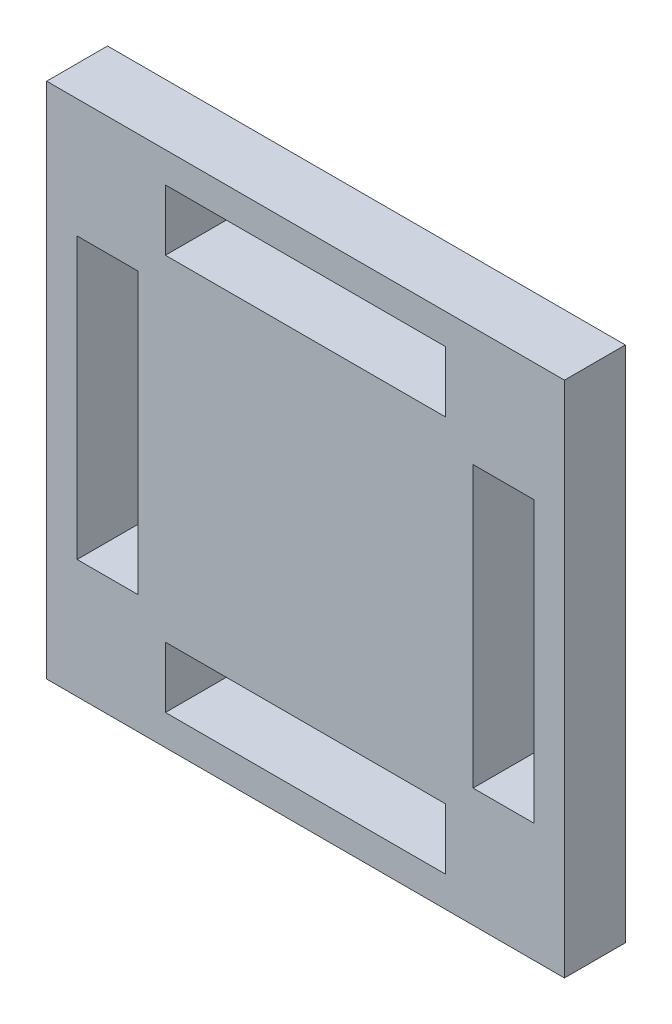
ISO-10303-21;
HEADER;
FILE_DESCRIPTION(('STEP AP214'),'2;1');
FILE_NAME('part.step','',(''),(''),'','','');
FILE_SCHEMA(('AUTOMOTIVE_DESIGN { 1 0 10303 214 1 1 1 1 }'));
ENDSEC;
DATA;
#1=APPLICATION_CONTEXT('core data for automotive mechanical design processes');
#2=APPLICATION_PROTOCOL_DEFINITION('international standard','automotive_design',2000,#1);
#3=PRODUCT_CONTEXT('',#1,'mechanical');
#4=PRODUCT('Part','Part','',(#3));
#5=PRODUCT_RELATED_PRODUCT_CATEGORY('part','',(#4));
#6=PRODUCT_DEFINITION_FORMATION('','',#4);
#7=PRODUCT_DEFINITION_CONTEXT('part definition',#1,'design');
#8=PRODUCT_DEFINITION('design','',#6,#7);
#9=PRODUCT_DEFINITION_SHAPE('','',#8);
#10=(LENGTH_UNIT() NAMED_UNIT(*) SI_UNIT(.MILLI.,.METRE.));
#11=(NAMED_UNIT(*) PLANE_ANGLE_UNIT() SI_UNIT($,.RADIAN.));
#12=(NAMED_UNIT(*) SI_UNIT($,.STERADIAN.) SOLID_ANGLE_UNIT());
#13=UNCERTAINTY_MEASURE_WITH_UNIT(LENGTH_MEASURE(1.E-05),#10,'distance_accuracy_value','');
#14=(GEOMETRIC_REPRESENTATION_CONTEXT(3) GLOBAL_UNCERTAINTY_ASSIGNED_CONTEXT((#13)) GLOBAL_UNIT_ASSIGNED_CONTEXT((#10,
#11,#12)) REPRESENTATION_CONTEXT('',''));
#15=CARTESIAN_POINT('',(0.,0.,0.));
#16=DIRECTION('',(0.,0.,1.));
#17=DIRECTION('',(1.,0.,0.));
#18=AXIS2_PLACEMENT_3D('',#15,#16,#17);
#19=CARTESIAN_POINT('',(0.,0.,0.));
#20=DIRECTION('',(0.,0.,-1.));
#21=DIRECTION('',(-1.,0.,0.));
#22=AXIS2_PLACEMENT_3D('',#19,#20,#21);
#23=PLANE('',#22);
#24=CARTESIAN_POINT('',(0.,0.,0.));
#25=DIRECTION('',(0.,0.,-1.));
#26=DIRECTION('',(-1.,0.,0.));
#27=AXIS2_PLACEMENT_3D('',#24,#25,#26);
#28=CIRCLE('',#27,17.5);
#29=CARTESIAN_POINT('',(-17.5,0.,0.));
#30=VERTEX_POINT('',#29);
#31=EDGE_CURVE('E38',#30,#30,#28,.T.);
#32=ORIENTED_EDGE('',*,*,#31,.F.);
#33=EDGE_LOOP('',(#32));
#34=FACE_BOUND('',#33,.T.);
#35=DIRECTION('',(1.,0.,0.));
#36=VECTOR('',#35,1.);
#37=CARTESIAN_POINT('',(-27.5,27.5,0.));
#38=LINE('',#37,#36);
#39=CARTESIAN_POINT('',(-27.5,27.5,0.));
#40=VERTEX_POINT('',#39);
#41=CARTESIAN_POINT('',(27.5,27.5,0.));
#42=VERTEX_POINT('',#41);
#43=EDGE_CURVE('E355',#40,#42,#38,.T.);
#44=ORIENTED_EDGE('',*,*,#43,.T.);
#45=DIRECTION('',(0.,-1.,0.));
#46=VECTOR('',#45,1.);
#47=CARTESIAN_POINT('',(27.5,-27.5,0.));
#48=LINE('',#47,#46);
#49=CARTESIAN_POINT('',(27.5,-27.5,0.));
#50=VERTEX_POINT('',#49);
#51=EDGE_CURVE('E254',#42,#50,#48,.T.);
#52=ORIENTED_EDGE('',*,*,#51,.T.);
#53=DIRECTION('',(-1.,0.,0.));
#54=VECTOR('',#53,1.);
#55=CARTESIAN_POINT('',(-27.5,-27.5,0.));
#56=LINE('',#55,#54);
#57=CARTESIAN_POINT('',(-27.5,-27.5,0.));
#58=VERTEX_POINT('',#57);
#59=EDGE_CURVE('E351',#50,#58,#56,.T.);
#60=ORIENTED_EDGE('',*,*,#59,.T.);
#61=DIRECTION('',(0.,1.,0.));
#62=VECTOR('',#61,1.);
#63=CARTESIAN_POINT('',(-27.5,-27.5,0.));
#64=LINE('',#63,#62);
#65=EDGE_CURVE('E57',#58,#40,#64,.T.);
#66=ORIENTED_EDGE('',*,*,#65,.T.);
#67=EDGE_LOOP('',(#44,#52,#60,#66));
#68=FACE_BOUND('',#67,.T.);
#69=ADVANCED_FACE('F35',(#34,#68),#23,.T.);
#70=CARTESIAN_POINT('',(0.,0.,1.));
#71=DIRECTION('',(0.,0.,-1.));
#72=DIRECTION('',(-1.,0.,0.));
#73=AXIS2_PLACEMENT_3D('',#70,#71,#72);
#74=CYLINDRICAL_SURFACE('',#73,17.5);
#75=CARTESIAN_POINT('',(0.,0.,1.));
#76=DIRECTION('',(0.,0.,-1.));
#77=DIRECTION('',(-1.,0.,0.));
#78=AXIS2_PLACEMENT_3D('',#75,#76,#77);
#79=CIRCLE('',#78,17.5);
#80=CARTESIAN_POINT('',(-17.5,0.,1.));
#81=VERTEX_POINT('',#80);
#82=EDGE_CURVE('E11',#81,#81,#79,.T.);
#83=ORIENTED_EDGE('',*,*,#82,.F.);
#84=EDGE_LOOP('',(#83));
#85=FACE_BOUND('',#84,.T.);
#86=ORIENTED_EDGE('',*,*,#31,.T.);
#87=EDGE_LOOP('',(#86));
#88=FACE_BOUND('',#87,.T.);
#89=ADVANCED_FACE('F442',(#85,#88),#74,.F.);
#90=CARTESIAN_POINT('',(0.,0.,1.));
#91=DIRECTION('',(0.,0.,-1.));
#92=DIRECTION('',(-1.,0.,0.));
#93=AXIS2_PLACEMENT_3D('',#90,#91,#92);
#94=PLANE('',#93);
#95=ORIENTED_EDGE('',*,*,#82,.T.);
#96=EDGE_LOOP('',(#95));
#97=FACE_BOUND('',#96,.T.);
#98=ADVANCED_FACE('F447',(#97),#94,.T.);
#99=CARTESIAN_POINT('',(0.,0.,5.));
#100=DIRECTION('',(0.,0.,-1.));
#101=DIRECTION('',(-1.,0.,0.));
#102=AXIS2_PLACEMENT_3D('',#99,#100,#101);
#103=PLANE('',#102);
#104=DIRECTION('',(-1.,0.,0.));
#105=VECTOR('',#104,1.);
#106=CARTESIAN_POINT('',(37.5,-37.5,5.));
#107=LINE('',#106,#105);
#108=CARTESIAN_POINT('',(23.,-37.5,5.));
#109=VERTEX_POINT('',#108);
#110=CARTESIAN_POINT('',(-23.,-37.5,5.));
#111=VERTEX_POINT('',#110);
#112=EDGE_CURVE('E221',#109,#111,#107,.T.);
#113=ORIENTED_EDGE('',*,*,#112,.F.);
#114=DIRECTION('',(0.,-1.,0.));
#115=VECTOR('',#114,1.);
#116=CARTESIAN_POINT('',(23.,-27.5,5.));
#117=LINE('',#116,#115);
#118=CARTESIAN_POINT('',(23.,-27.5,5.));
#119=VERTEX_POINT('',#118);
#120=EDGE_CURVE('E295',#119,#109,#117,.T.);
#121=ORIENTED_EDGE('',*,*,#120,.F.);
#122=DIRECTION('',(-1.,0.,0.));
#123=VECTOR('',#122,1.);
#124=CARTESIAN_POINT('',(-27.5,-27.5,5.));
#125=LINE('',#124,#123);
#126=CARTESIAN_POINT('',(27.5,-27.5,5.));
#127=VERTEX_POINT('',#126);
#128=EDGE_CURVE('E337',#127,#119,#125,.T.);
#129=ORIENTED_EDGE('',*,*,#128,.F.);
#130=DIRECTION('',(0.,-1.,0.));
#131=VECTOR('',#130,1.);
#132=CARTESIAN_POINT('',(27.5,-27.5,5.));
#133=LINE('',#132,#131);
#134=CARTESIAN_POINT('',(27.5,-23.,5.));
#135=VERTEX_POINT('',#134);
#136=EDGE_CURVE('E336',#135,#127,#133,.T.);
#137=ORIENTED_EDGE('',*,*,#136,.F.);
#138=DIRECTION('',(-1.,0.,0.));
#139=VECTOR('',#138,1.);
#140=CARTESIAN_POINT('',(37.5,-23.,5.));
#141=LINE('',#140,#139);
#142=CARTESIAN_POINT('',(37.5,-23.,5.));
#143=VERTEX_POINT('',#142);
#144=EDGE_CURVE('E246',#143,#135,#141,.T.);
#145=ORIENTED_EDGE('',*,*,#144,.F.);
#146=DIRECTION('',(0.,-1.,0.));
#147=VECTOR('',#146,1.);
#148=CARTESIAN_POINT('',(37.5,-37.5,5.));
#149=LINE('',#148,#147);
#150=CARTESIAN_POINT('',(37.5,23.,5.));
#151=VERTEX_POINT('',#150);
#152=EDGE_CURVE('E223',#151,#143,#149,.T.);
#153=ORIENTED_EDGE('',*,*,#152,.F.);
#154=DIRECTION('',(1.,0.,0.));
#155=VECTOR('',#154,1.);
#156=CARTESIAN_POINT('',(37.5,23.,5.));
#157=LINE('',#156,#155);
#158=CARTESIAN_POINT('',(27.5,23.,5.));
#159=VERTEX_POINT('',#158);
#160=EDGE_CURVE('E239',#159,#151,#157,.T.);
#161=ORIENTED_EDGE('',*,*,#160,.F.);
#162=CARTESIAN_POINT('',(27.5,27.5,5.));
#163=VERTEX_POINT('',#162);
#164=EDGE_CURVE('E332',#163,#159,#133,.T.);
#165=ORIENTED_EDGE('',*,*,#164,.F.);
#166=DIRECTION('',(1.,0.,0.));
#167=VECTOR('',#166,1.);
#168=CARTESIAN_POINT('',(-27.5,27.5,5.));
#169=LINE('',#168,#167);
#170=CARTESIAN_POINT('',(23.,27.5,5.));
#171=VERTEX_POINT('',#170);
#172=EDGE_CURVE('E344',#171,#163,#169,.T.);
#173=ORIENTED_EDGE('',*,*,#172,.F.);
#174=DIRECTION('',(0.,-1.,0.));
#175=VECTOR('',#174,1.);
#176=CARTESIAN_POINT('',(23.,27.5,5.));
#177=LINE('',#176,#175);
#178=CARTESIAN_POINT('',(23.,37.5,5.));
#179=VERTEX_POINT('',#178);
#180=EDGE_CURVE('E319',#179,#171,#177,.T.);
#181=ORIENTED_EDGE('',*,*,#180,.F.);
#182=DIRECTION('',(1.,0.,0.));
#183=VECTOR('',#182,1.);
#184=CARTESIAN_POINT('',(37.5,37.5,5.));
#185=LINE('',#184,#183);
#186=CARTESIAN_POINT('',(-23.,37.5,5.));
#187=VERTEX_POINT('',#186);
#188=EDGE_CURVE('E414',#187,#179,#185,.T.);
#189=ORIENTED_EDGE('',*,*,#188,.F.);
#190=DIRECTION('',(0.,1.,0.));
#191=VECTOR('',#190,1.);
#192=CARTESIAN_POINT('',(-23.,27.5,5.));
#193=LINE('',#192,#191);
#194=CARTESIAN_POINT('',(-23.,27.5,5.));
#195=VERTEX_POINT('',#194);
#196=EDGE_CURVE('E312',#195,#187,#193,.T.);
#197=ORIENTED_EDGE('',*,*,#196,.F.);
#198=CARTESIAN_POINT('',(-27.5,27.5,5.));
#199=VERTEX_POINT('',#198);
#200=EDGE_CURVE('E345',#199,#195,#169,.T.);
#201=ORIENTED_EDGE('',*,*,#200,.F.);
#202=DIRECTION('',(0.,1.,0.));
#203=VECTOR('',#202,1.);
#204=CARTESIAN_POINT('',(-27.5,-27.5,5.));
#205=LINE('',#204,#203);
#206=CARTESIAN_POINT('',(-27.5,23.,5.));
#207=VERTEX_POINT('',#206);
#208=EDGE_CURVE('E340',#207,#199,#205,.T.);
#209=ORIENTED_EDGE('',*,*,#208,.F.);
#210=DIRECTION('',(1.,0.,0.));
#211=VECTOR('',#210,1.);
#212=CARTESIAN_POINT('',(-27.5,23.,5.));
#213=LINE('',#212,#211);
#214=CARTESIAN_POINT('',(-37.5,23.,5.));
#215=VERTEX_POINT('',#214);
#216=EDGE_CURVE('E264',#215,#207,#213,.T.);
#217=ORIENTED_EDGE('',*,*,#216,.F.);
#218=DIRECTION('',(0.,1.,0.));
#219=VECTOR('',#218,1.);
#220=CARTESIAN_POINT('',(-37.5,-37.5,5.));
#221=LINE('',#220,#219);
#222=CARTESIAN_POINT('',(-37.5,-23.,5.));
#223=VERTEX_POINT('',#222);
#224=EDGE_CURVE('E412',#223,#215,#221,.T.);
#225=ORIENTED_EDGE('',*,*,#224,.F.);
#226=DIRECTION('',(-1.,0.,0.));
#227=VECTOR('',#226,1.);
#228=CARTESIAN_POINT('',(-27.5,-23.,5.));
#229=LINE('',#228,#227);
#230=CARTESIAN_POINT('',(-27.5,-23.,5.));
#231=VERTEX_POINT('',#230);
#232=EDGE_CURVE('E271',#231,#223,#229,.T.);
#233=ORIENTED_EDGE('',*,*,#232,.F.);
#234=CARTESIAN_POINT('',(-27.5,-27.5,5.));
#235=VERTEX_POINT('',#234);
#236=EDGE_CURVE('E341',#235,#231,#205,.T.);
#237=ORIENTED_EDGE('',*,*,#236,.F.);
#238=CARTESIAN_POINT('',(-23.,-27.5,5.));
#239=VERTEX_POINT('',#238);
#240=EDGE_CURVE('E335',#239,#235,#125,.T.);
#241=ORIENTED_EDGE('',*,*,#240,.F.);
#242=DIRECTION('',(0.,1.,0.));
#243=VECTOR('',#242,1.);
#244=CARTESIAN_POINT('',(-23.,-27.5,5.));
#245=LINE('',#244,#243);
#246=EDGE_CURVE('E288',#111,#239,#245,.T.);
#247=ORIENTED_EDGE('',*,*,#246,.F.);
#248=EDGE_LOOP('',(#113,#121,#129,#137,#145,#153,#161,#165,#173,#181,#189,#197,#201,#209,#217,
#225,#233,#237,#241,#247));
#249=FACE_BOUND('',#248,.T.);
#250=DIRECTION('',(0.,1.,0.));
#251=VECTOR('',#250,1.);
#252=CARTESIAN_POINT('',(-42.5,-42.5,5.));
#253=LINE('',#252,#251);
#254=CARTESIAN_POINT('',(-42.5,-42.5,5.));
#255=VERTEX_POINT('',#254);
#256=CARTESIAN_POINT('',(-42.5,42.5,5.));
#257=VERTEX_POINT('',#256);
#258=EDGE_CURVE('E202',#255,#257,#253,.T.);
#259=ORIENTED_EDGE('',*,*,#258,.T.);
#260=DIRECTION('',(1.,0.,0.));
#261=VECTOR('',#260,1.);
#262=CARTESIAN_POINT('',(42.5,42.5,5.));
#263=LINE('',#262,#261);
#264=CARTESIAN_POINT('',(42.5,42.5,5.));
#265=VERTEX_POINT('',#264);
#266=EDGE_CURVE('E211',#257,#265,#263,.T.);
#267=ORIENTED_EDGE('',*,*,#266,.T.);
#268=DIRECTION('',(0.,-1.,0.));
#269=VECTOR('',#268,1.);
#270=CARTESIAN_POINT('',(42.5,-42.5,5.));
#271=LINE('',#270,#269);
#272=CARTESIAN_POINT('',(42.5,-42.5,5.));
#273=VERTEX_POINT('',#272);
#274=EDGE_CURVE('E217',#265,#273,#271,.T.);
#275=ORIENTED_EDGE('',*,*,#274,.T.);
#276=DIRECTION('',(-1.,0.,0.));
#277=VECTOR('',#276,1.);
#278=CARTESIAN_POINT('',(42.5,-42.5,5.));
#279=LINE('',#278,#277);
#280=EDGE_CURVE('E208',#273,#255,#279,.T.);
#281=ORIENTED_EDGE('',*,*,#280,.T.);
#282=EDGE_LOOP('',(#259,#267,#275,#281));
#283=FACE_BOUND('',#282,.T.);
#284=ADVANCED_FACE('F219',(#249,#283),#103,.T.);
#285=CARTESIAN_POINT('',(27.5,-27.5,5.));
#286=DIRECTION('',(1.,0.,0.));
#287=DIRECTION('',(0.,0.,-1.));
#288=AXIS2_PLACEMENT_3D('',#285,#286,#287);
#289=PLANE('',#288);
#290=ORIENTED_EDGE('',*,*,#51,.F.);
#291=DIRECTION('',(0.,0.,-1.));
#292=VECTOR('',#291,1.);
#293=CARTESIAN_POINT('',(27.5,27.5,5.));
#294=LINE('',#293,#292);
#295=EDGE_CURVE('E358',#163,#42,#294,.T.);
#296=ORIENTED_EDGE('',*,*,#295,.F.);
#297=ORIENTED_EDGE('',*,*,#164,.T.);
#298=DIRECTION('',(0.,0.,-1.));
#299=VECTOR('',#298,1.);
#300=CARTESIAN_POINT('',(27.5,23.,15.));
#301=LINE('',#300,#299);
#302=CARTESIAN_POINT('',(27.5,23.,15.));
#303=VERTEX_POINT('',#302);
#304=EDGE_CURVE('E255',#303,#159,#301,.T.);
#305=ORIENTED_EDGE('',*,*,#304,.F.);
#306=DIRECTION('',(0.,1.,0.));
#307=VECTOR('',#306,1.);
#308=CARTESIAN_POINT('',(27.5,23.,15.));
#309=LINE('',#308,#307);
#310=CARTESIAN_POINT('',(27.5,-23.,15.));
#311=VERTEX_POINT('',#310);
#312=EDGE_CURVE('E238',#311,#303,#309,.T.);
#313=ORIENTED_EDGE('',*,*,#312,.F.);
#314=DIRECTION('',(0.,0.,-1.));
#315=VECTOR('',#314,1.);
#316=CARTESIAN_POINT('',(27.5,-23.,15.));
#317=LINE('',#316,#315);
#318=EDGE_CURVE('E257',#311,#135,#317,.T.);
#319=ORIENTED_EDGE('',*,*,#318,.T.);
#320=ORIENTED_EDGE('',*,*,#136,.T.);
#321=DIRECTION('',(0.,0.,-1.));
#322=VECTOR('',#321,1.);
#323=CARTESIAN_POINT('',(27.5,-27.5,5.));
#324=LINE('',#323,#322);
#325=EDGE_CURVE('E348',#127,#50,#324,.T.);
#326=ORIENTED_EDGE('',*,*,#325,.T.);
#327=EDGE_LOOP('',(#290,#296,#297,#305,#313,#319,#320,#326));
#328=FACE_BOUND('',#327,.T.);
#329=ADVANCED_FACE('F368',(#328),#289,.T.);
#330=CARTESIAN_POINT('',(-27.5,27.5,5.));
#331=DIRECTION('',(0.,1.,0.));
#332=DIRECTION('',(0.,0.,1.));
#333=AXIS2_PLACEMENT_3D('',#330,#331,#332);
#334=PLANE('',#333);
#335=ORIENTED_EDGE('',*,*,#43,.F.);
#336=DIRECTION('',(0.,0.,-1.));
#337=VECTOR('',#336,1.);
#338=CARTESIAN_POINT('',(-27.5,27.5,5.));
#339=LINE('',#338,#337);
#340=EDGE_CURVE('E360',#199,#40,#339,.T.);
#341=ORIENTED_EDGE('',*,*,#340,.F.);
#342=ORIENTED_EDGE('',*,*,#200,.T.);
#343=DIRECTION('',(0.,0.,-1.));
#344=VECTOR('',#343,1.);
#345=CARTESIAN_POINT('',(-23.,27.5,15.));
#346=LINE('',#345,#344);
#347=CARTESIAN_POINT('',(-23.,27.5,15.));
#348=VERTEX_POINT('',#347);
#349=EDGE_CURVE('E329',#348,#195,#346,.T.);
#350=ORIENTED_EDGE('',*,*,#349,.F.);
#351=DIRECTION('',(-1.,0.,0.));
#352=VECTOR('',#351,1.);
#353=CARTESIAN_POINT('',(23.,27.5,15.));
#354=LINE('',#353,#352);
#355=CARTESIAN_POINT('',(23.,27.5,15.));
#356=VERTEX_POINT('',#355);
#357=EDGE_CURVE('E311',#356,#348,#354,.T.);
#358=ORIENTED_EDGE('',*,*,#357,.F.);
#359=DIRECTION('',(0.,0.,-1.));
#360=VECTOR('',#359,1.);
#361=CARTESIAN_POINT('',(23.,27.5,15.));
#362=LINE('',#361,#360);
#363=EDGE_CURVE('E318',#356,#171,#362,.T.);
#364=ORIENTED_EDGE('',*,*,#363,.T.);
#365=ORIENTED_EDGE('',*,*,#172,.T.);
#366=ORIENTED_EDGE('',*,*,#295,.T.);
#367=EDGE_LOOP('',(#335,#341,#342,#350,#358,#364,#365,#366));
#368=FACE_BOUND('',#367,.T.);
#369=ADVANCED_FACE('F378',(#368),#334,.T.);
#370=CARTESIAN_POINT('',(-27.5,-27.5,5.));
#371=DIRECTION('',(-1.,0.,0.));
#372=DIRECTION('',(0.,0.,1.));
#373=AXIS2_PLACEMENT_3D('',#370,#371,#372);
#374=PLANE('',#373);
#375=ORIENTED_EDGE('',*,*,#65,.F.);
#376=DIRECTION('',(0.,0.,-1.));
#377=VECTOR('',#376,1.);
#378=CARTESIAN_POINT('',(-27.5,-27.5,5.));
#379=LINE('',#378,#377);
#380=EDGE_CURVE('E362',#235,#58,#379,.T.);
#381=ORIENTED_EDGE('',*,*,#380,.F.);
#382=ORIENTED_EDGE('',*,*,#236,.T.);
#383=DIRECTION('',(0.,0.,-1.));
#384=VECTOR('',#383,1.);
#385=CARTESIAN_POINT('',(-27.5,-23.,15.));
#386=LINE('',#385,#384);
#387=CARTESIAN_POINT('',(-27.5,-23.,15.));
#388=VERTEX_POINT('',#387);
#389=EDGE_CURVE('E270',#388,#231,#386,.T.);
#390=ORIENTED_EDGE('',*,*,#389,.F.);
#391=DIRECTION('',(0.,-1.,0.));
#392=VECTOR('',#391,1.);
#393=CARTESIAN_POINT('',(-27.5,23.,15.));
#394=LINE('',#393,#392);
#395=CARTESIAN_POINT('',(-27.5,23.,15.));
#396=VERTEX_POINT('',#395);
#397=EDGE_CURVE('E260',#396,#388,#394,.T.);
#398=ORIENTED_EDGE('',*,*,#397,.F.);
#399=DIRECTION('',(0.,0.,-1.));
#400=VECTOR('',#399,1.);
#401=CARTESIAN_POINT('',(-27.5,23.,15.));
#402=LINE('',#401,#400);
#403=EDGE_CURVE('E249',#396,#207,#402,.T.);
#404=ORIENTED_EDGE('',*,*,#403,.T.);
#405=ORIENTED_EDGE('',*,*,#208,.T.);
#406=ORIENTED_EDGE('',*,*,#340,.T.);
#407=EDGE_LOOP('',(#375,#381,#382,#390,#398,#404,#405,#406));
#408=FACE_BOUND('',#407,.T.);
#409=ADVANCED_FACE('F432',(#408),#374,.T.);
#410=CARTESIAN_POINT('',(-27.5,-27.5,5.));
#411=DIRECTION('',(0.,-1.,0.));
#412=DIRECTION('',(0.,0.,-1.));
#413=AXIS2_PLACEMENT_3D('',#410,#411,#412);
#414=PLANE('',#413);
#415=ORIENTED_EDGE('',*,*,#59,.F.);
#416=ORIENTED_EDGE('',*,*,#325,.F.);
#417=ORIENTED_EDGE('',*,*,#128,.T.);
#418=DIRECTION('',(0.,0.,-1.));
#419=VECTOR('',#418,1.);
#420=CARTESIAN_POINT('',(23.,-27.5,15.));
#421=LINE('',#420,#419);
#422=CARTESIAN_POINT('',(23.,-27.5,15.));
#423=VERTEX_POINT('',#422);
#424=EDGE_CURVE('E274',#423,#119,#421,.T.);
#425=ORIENTED_EDGE('',*,*,#424,.F.);
#426=DIRECTION('',(1.,0.,0.));
#427=VECTOR('',#426,1.);
#428=CARTESIAN_POINT('',(23.,-27.5,15.));
#429=LINE('',#428,#427);
#430=CARTESIAN_POINT('',(-23.,-27.5,15.));
#431=VERTEX_POINT('',#430);
#432=EDGE_CURVE('E291',#431,#423,#429,.T.);
#433=ORIENTED_EDGE('',*,*,#432,.F.);
#434=DIRECTION('',(0.,0.,-1.));
#435=VECTOR('',#434,1.);
#436=CARTESIAN_POINT('',(-23.,-27.5,15.));
#437=LINE('',#436,#435);
#438=EDGE_CURVE('E301',#431,#239,#437,.T.);
#439=ORIENTED_EDGE('',*,*,#438,.T.);
#440=ORIENTED_EDGE('',*,*,#240,.T.);
#441=ORIENTED_EDGE('',*,*,#380,.T.);
#442=EDGE_LOOP('',(#415,#416,#417,#425,#433,#439,#440,#441));
#443=FACE_BOUND('',#442,.T.);
#444=ADVANCED_FACE('F373',(#443),#414,.T.);
#445=CARTESIAN_POINT('',(0.,0.,15.));
#446=DIRECTION('',(0.,0.,-1.));
#447=DIRECTION('',(-1.,0.,0.));
#448=AXIS2_PLACEMENT_3D('',#445,#446,#447);
#449=PLANE('',#448);
#450=DIRECTION('',(-1.,0.,0.));
#451=VECTOR('',#450,1.);
#452=CARTESIAN_POINT('',(37.5,37.5,15.));
#453=LINE('',#452,#451);
#454=CARTESIAN_POINT('',(23.,37.5,15.));
#455=VERTEX_POINT('',#454);
#456=CARTESIAN_POINT('',(-23.,37.5,15.));
#457=VERTEX_POINT('',#456);
#458=EDGE_CURVE('E231',#455,#457,#453,.T.);
#459=ORIENTED_EDGE('',*,*,#458,.F.);
#460=DIRECTION('',(0.,-1.,0.));
#461=VECTOR('',#460,1.);
#462=CARTESIAN_POINT('',(23.,27.5,15.));
#463=LINE('',#462,#461);
#464=EDGE_CURVE('E308',#455,#356,#463,.T.);
#465=ORIENTED_EDGE('',*,*,#464,.T.);
#466=ORIENTED_EDGE('',*,*,#357,.T.);
#467=DIRECTION('',(0.,1.,0.));
#468=VECTOR('',#467,1.);
#469=CARTESIAN_POINT('',(-23.,27.5,15.));
#470=LINE('',#469,#468);
#471=EDGE_CURVE('E315',#348,#457,#470,.T.);
#472=ORIENTED_EDGE('',*,*,#471,.T.);
#473=EDGE_LOOP('',(#459,#465,#466,#472));
#474=FACE_BOUND('',#473,.T.);
#475=DIRECTION('',(0.,-1.,0.));
#476=VECTOR('',#475,1.);
#477=CARTESIAN_POINT('',(-37.5,-37.5,15.));
#478=LINE('',#477,#476);
#479=CARTESIAN_POINT('',(-37.5,23.,15.));
#480=VERTEX_POINT('',#479);
#481=CARTESIAN_POINT('',(-37.5,-23.,15.));
#482=VERTEX_POINT('',#481);
#483=EDGE_CURVE('E404',#480,#482,#478,.T.);
#484=ORIENTED_EDGE('',*,*,#483,.F.);
#485=DIRECTION('',(1.,0.,0.));
#486=VECTOR('',#485,1.);
#487=CARTESIAN_POINT('',(-27.5,23.,15.));
#488=LINE('',#487,#486);
#489=EDGE_CURVE('E267',#480,#396,#488,.T.);
#490=ORIENTED_EDGE('',*,*,#489,.T.);
#491=ORIENTED_EDGE('',*,*,#397,.T.);
#492=DIRECTION('',(-1.,0.,0.));
#493=VECTOR('',#492,1.);
#494=CARTESIAN_POINT('',(-27.5,-23.,15.));
#495=LINE('',#494,#493);
#496=EDGE_CURVE('E263',#388,#482,#495,.T.);
#497=ORIENTED_EDGE('',*,*,#496,.T.);
#498=EDGE_LOOP('',(#484,#490,#491,#497));
#499=FACE_BOUND('',#498,.T.);
#500=DIRECTION('',(1.,0.,0.));
#501=VECTOR('',#500,1.);
#502=CARTESIAN_POINT('',(37.5,-37.5,15.));
#503=LINE('',#502,#501);
#504=CARTESIAN_POINT('',(-23.,-37.5,15.));
#505=VERTEX_POINT('',#504);
#506=CARTESIAN_POINT('',(23.,-37.5,15.));
#507=VERTEX_POINT('',#506);
#508=EDGE_CURVE('E400',#505,#507,#503,.T.);
#509=ORIENTED_EDGE('',*,*,#508,.F.);
#510=DIRECTION('',(0.,1.,0.));
#511=VECTOR('',#510,1.);
#512=CARTESIAN_POINT('',(-23.,-27.5,15.));
#513=LINE('',#512,#511);
#514=EDGE_CURVE('E287',#505,#431,#513,.T.);
#515=ORIENTED_EDGE('',*,*,#514,.T.);
#516=ORIENTED_EDGE('',*,*,#432,.T.);
#517=DIRECTION('',(0.,-1.,0.));
#518=VECTOR('',#517,1.);
#519=CARTESIAN_POINT('',(23.,-27.5,15.));
#520=LINE('',#519,#518);
#521=EDGE_CURVE('E284',#423,#507,#520,.T.);
#522=ORIENTED_EDGE('',*,*,#521,.T.);
#523=EDGE_LOOP('',(#509,#515,#516,#522));
#524=FACE_BOUND('',#523,.T.);
#525=ORIENTED_EDGE('',*,*,#312,.T.);
#526=DIRECTION('',(1.,0.,0.));
#527=VECTOR('',#526,1.);
#528=CARTESIAN_POINT('',(37.5,23.,15.));
#529=LINE('',#528,#527);
#530=CARTESIAN_POINT('',(37.5,23.,15.));
#531=VERTEX_POINT('',#530);
#532=EDGE_CURVE('E242',#303,#531,#529,.T.);
#533=ORIENTED_EDGE('',*,*,#532,.T.);
#534=DIRECTION('',(0.,1.,0.));
#535=VECTOR('',#534,1.);
#536=CARTESIAN_POINT('',(37.5,-37.5,15.));
#537=LINE('',#536,#535);
#538=CARTESIAN_POINT('',(37.5,-23.,15.));
#539=VERTEX_POINT('',#538);
#540=EDGE_CURVE('E398',#539,#531,#537,.T.);
#541=ORIENTED_EDGE('',*,*,#540,.F.);
#542=DIRECTION('',(-1.,0.,0.));
#543=VECTOR('',#542,1.);
#544=CARTESIAN_POINT('',(37.5,-23.,15.));
#545=LINE('',#544,#543);
#546=EDGE_CURVE('E49',#539,#311,#545,.T.);
#547=ORIENTED_EDGE('',*,*,#546,.T.);
#548=EDGE_LOOP('',(#525,#533,#541,#547));
#549=FACE_BOUND('',#548,.T.);
#550=DIRECTION('',(0.,-1.,0.));
#551=VECTOR('',#550,1.);
#552=CARTESIAN_POINT('',(-42.5,-42.5,15.));
#553=LINE('',#552,#551);
#554=CARTESIAN_POINT('',(-42.5,42.5,15.));
#555=VERTEX_POINT('',#554);
#556=CARTESIAN_POINT('',(-42.5,-42.5,15.));
#557=VERTEX_POINT('',#556);
#558=EDGE_CURVE('E204',#555,#557,#553,.T.);
#559=ORIENTED_EDGE('',*,*,#558,.T.);
#560=DIRECTION('',(1.,0.,0.));
#561=VECTOR('',#560,1.);
#562=CARTESIAN_POINT('',(42.5,-42.5,15.));
#563=LINE('',#562,#561);
#564=CARTESIAN_POINT('',(42.5,-42.5,15.));
#565=VERTEX_POINT('',#564);
#566=EDGE_CURVE('E409',#557,#565,#563,.T.);
#567=ORIENTED_EDGE('',*,*,#566,.T.);
#568=DIRECTION('',(0.,1.,0.));
#569=VECTOR('',#568,1.);
#570=CARTESIAN_POINT('',(42.5,-42.5,15.));
#571=LINE('',#570,#569);
#572=CARTESIAN_POINT('',(42.5,42.5,15.));
#573=VERTEX_POINT('',#572);
#574=EDGE_CURVE('E236',#565,#573,#571,.T.);
#575=ORIENTED_EDGE('',*,*,#574,.T.);
#576=DIRECTION('',(-1.,0.,0.));
#577=VECTOR('',#576,1.);
#578=CARTESIAN_POINT('',(42.5,42.5,15.));
#579=LINE('',#578,#577);
#580=EDGE_CURVE('E322',#573,#555,#579,.T.);
#581=ORIENTED_EDGE('',*,*,#580,.T.);
#582=EDGE_LOOP('',(#559,#567,#575,#581));
#583=FACE_BOUND('',#582,.T.);
#584=ADVANCED_FACE('F396',(#474,#499,#524,#549,#583),#449,.F.);
#585=CARTESIAN_POINT('',(37.5,23.,15.));
#586=DIRECTION('',(0.,1.,0.));
#587=DIRECTION('',(0.,0.,1.));
#588=AXIS2_PLACEMENT_3D('',#585,#586,#587);
#589=PLANE('',#588);
#590=ORIENTED_EDGE('',*,*,#160,.T.);
#591=DIRECTION('',(0.,0.,-1.));
#592=VECTOR('',#591,1.);
#593=CARTESIAN_POINT('',(37.5,23.,15.));
#594=LINE('',#593,#592);
#595=EDGE_CURVE('E252',#531,#151,#594,.T.);
#596=ORIENTED_EDGE('',*,*,#595,.F.);
#597=ORIENTED_EDGE('',*,*,#532,.F.);
#598=ORIENTED_EDGE('',*,*,#304,.T.);
#599=EDGE_LOOP('',(#590,#596,#597,#598));
#600=FACE_BOUND('',#599,.T.);
#601=ADVANCED_FACE('F391',(#600),#589,.F.);
#602=CARTESIAN_POINT('',(37.5,-23.,15.));
#603=DIRECTION('',(0.,-1.,0.));
#604=DIRECTION('',(0.,0.,-1.));
#605=AXIS2_PLACEMENT_3D('',#602,#603,#604);
#606=PLANE('',#605);
#607=ORIENTED_EDGE('',*,*,#144,.T.);
#608=ORIENTED_EDGE('',*,*,#318,.F.);
#609=ORIENTED_EDGE('',*,*,#546,.F.);
#610=DIRECTION('',(0.,0.,-1.));
#611=VECTOR('',#610,1.);
#612=CARTESIAN_POINT('',(37.5,-23.,15.));
#613=LINE('',#612,#611);
#614=EDGE_CURVE('E245',#539,#143,#613,.T.);
#615=ORIENTED_EDGE('',*,*,#614,.T.);
#616=EDGE_LOOP('',(#607,#608,#609,#615));
#617=FACE_BOUND('',#616,.T.);
#618=ADVANCED_FACE('F416',(#617),#606,.F.);
#619=CARTESIAN_POINT('',(23.,27.5,15.));
#620=DIRECTION('',(1.,0.,0.));
#621=DIRECTION('',(0.,0.,-1.));
#622=AXIS2_PLACEMENT_3D('',#619,#620,#621);
#623=PLANE('',#622);
#624=ORIENTED_EDGE('',*,*,#180,.T.);
#625=ORIENTED_EDGE('',*,*,#363,.F.);
#626=ORIENTED_EDGE('',*,*,#464,.F.);
#627=DIRECTION('',(0.,0.,-1.));
#628=VECTOR('',#627,1.);
#629=CARTESIAN_POINT('',(23.,37.5,15.));
#630=LINE('',#629,#628);
#631=EDGE_CURVE('E297',#455,#179,#630,.T.);
#632=ORIENTED_EDGE('',*,*,#631,.T.);
#633=EDGE_LOOP('',(#624,#625,#626,#632));
#634=FACE_BOUND('',#633,.T.);
#635=ADVANCED_FACE('F490',(#634),#623,.F.);
#636=CARTESIAN_POINT('',(-23.,27.5,15.));
#637=DIRECTION('',(-1.,0.,0.));
#638=DIRECTION('',(0.,0.,1.));
#639=AXIS2_PLACEMENT_3D('',#636,#637,#638);
#640=PLANE('',#639);
#641=ORIENTED_EDGE('',*,*,#196,.T.);
#642=DIRECTION('',(0.,0.,-1.));
#643=VECTOR('',#642,1.);
#644=CARTESIAN_POINT('',(-23.,37.5,15.));
#645=LINE('',#644,#643);
#646=EDGE_CURVE('E327',#457,#187,#645,.T.);
#647=ORIENTED_EDGE('',*,*,#646,.F.);
#648=ORIENTED_EDGE('',*,*,#471,.F.);
#649=ORIENTED_EDGE('',*,*,#349,.T.);
#650=EDGE_LOOP('',(#641,#647,#648,#649));
#651=FACE_BOUND('',#650,.T.);
#652=ADVANCED_FACE('F488',(#651),#640,.F.);
#653=CARTESIAN_POINT('',(-27.5,23.,15.));
#654=DIRECTION('',(0.,1.,0.));
#655=DIRECTION('',(-1.,0.,0.));
#656=AXIS2_PLACEMENT_3D('',#653,#654,#655);
#657=PLANE('',#656);
#658=ORIENTED_EDGE('',*,*,#216,.T.);
#659=ORIENTED_EDGE('',*,*,#403,.F.);
#660=ORIENTED_EDGE('',*,*,#489,.F.);
#661=DIRECTION('',(0.,0.,-1.));
#662=VECTOR('',#661,1.);
#663=CARTESIAN_POINT('',(-37.5,23.,15.));
#664=LINE('',#663,#662);
#665=EDGE_CURVE('E278',#480,#215,#664,.T.);
#666=ORIENTED_EDGE('',*,*,#665,.T.);
#667=EDGE_LOOP('',(#658,#659,#660,#666));
#668=FACE_BOUND('',#667,.T.);
#669=ADVANCED_FACE('F475',(#668),#657,.F.);
#670=CARTESIAN_POINT('',(-27.5,-23.,15.));
#671=DIRECTION('',(0.,-1.,0.));
#672=DIRECTION('',(1.,0.,0.));
#673=AXIS2_PLACEMENT_3D('',#670,#671,#672);
#674=PLANE('',#673);
#675=ORIENTED_EDGE('',*,*,#232,.T.);
#676=DIRECTION('',(0.,0.,-1.));
#677=VECTOR('',#676,1.);
#678=CARTESIAN_POINT('',(-37.5,-23.,15.));
#679=LINE('',#678,#677);
#680=EDGE_CURVE('E281',#482,#223,#679,.T.);
#681=ORIENTED_EDGE('',*,*,#680,.F.);
#682=ORIENTED_EDGE('',*,*,#496,.F.);
#683=ORIENTED_EDGE('',*,*,#389,.T.);
#684=EDGE_LOOP('',(#675,#681,#682,#683));
#685=FACE_BOUND('',#684,.T.);
#686=ADVANCED_FACE('F480',(#685),#674,.F.);
#687=CARTESIAN_POINT('',(23.,-27.5,15.));
#688=DIRECTION('',(1.,0.,0.));
#689=DIRECTION('',(0.,0.,-1.));
#690=AXIS2_PLACEMENT_3D('',#687,#688,#689);
#691=PLANE('',#690);
#692=ORIENTED_EDGE('',*,*,#120,.T.);
#693=DIRECTION('',(0.,0.,-1.));
#694=VECTOR('',#693,1.);
#695=CARTESIAN_POINT('',(23.,-37.5,15.));
#696=LINE('',#695,#694);
#697=EDGE_CURVE('E294',#507,#109,#696,.T.);
#698=ORIENTED_EDGE('',*,*,#697,.F.);
#699=ORIENTED_EDGE('',*,*,#521,.F.);
#700=ORIENTED_EDGE('',*,*,#424,.T.);
#701=EDGE_LOOP('',(#692,#698,#699,#700));
#702=FACE_BOUND('',#701,.T.);
#703=ADVANCED_FACE('F421',(#702),#691,.F.);
#704=CARTESIAN_POINT('',(-23.,-27.5,15.));
#705=DIRECTION('',(-1.,0.,0.));
#706=DIRECTION('',(0.,0.,1.));
#707=AXIS2_PLACEMENT_3D('',#704,#705,#706);
#708=PLANE('',#707);
#709=ORIENTED_EDGE('',*,*,#246,.T.);
#710=ORIENTED_EDGE('',*,*,#438,.F.);
#711=ORIENTED_EDGE('',*,*,#514,.F.);
#712=DIRECTION('',(0.,0.,-1.));
#713=VECTOR('',#712,1.);
#714=CARTESIAN_POINT('',(-23.,-37.5,15.));
#715=LINE('',#714,#713);
#716=EDGE_CURVE('E303',#505,#111,#715,.T.);
#717=ORIENTED_EDGE('',*,*,#716,.T.);
#718=EDGE_LOOP('',(#709,#710,#711,#717));
#719=FACE_BOUND('',#718,.T.);
#720=ADVANCED_FACE('F426',(#719),#708,.F.);
#721=CARTESIAN_POINT('',(37.5,-37.5,135.208152801713));
#722=DIRECTION('',(1.,0.,0.));
#723=DIRECTION('',(0.,0.,-1.));
#724=AXIS2_PLACEMENT_3D('',#721,#722,#723);
#725=PLANE('',#724);
#726=ORIENTED_EDGE('',*,*,#540,.T.);
#727=ORIENTED_EDGE('',*,*,#595,.T.);
#728=ORIENTED_EDGE('',*,*,#152,.T.);
#729=ORIENTED_EDGE('',*,*,#614,.F.);
#730=EDGE_LOOP('',(#726,#727,#728,#729));
#731=FACE_BOUND('',#730,.T.);
#732=ADVANCED_FACE('F415',(#731),#725,.F.);
#733=CARTESIAN_POINT('',(37.5,37.5,135.208152801713));
#734=DIRECTION('',(0.,1.,0.));
#735=DIRECTION('',(0.,0.,1.));
#736=AXIS2_PLACEMENT_3D('',#733,#734,#735);
#737=PLANE('',#736);
#738=ORIENTED_EDGE('',*,*,#188,.T.);
#739=ORIENTED_EDGE('',*,*,#631,.F.);
#740=ORIENTED_EDGE('',*,*,#458,.T.);
#741=ORIENTED_EDGE('',*,*,#646,.T.);
#742=EDGE_LOOP('',(#738,#739,#740,#741));
#743=FACE_BOUND('',#742,.T.);
#744=ADVANCED_FACE('F492',(#743),#737,.F.);
#745=CARTESIAN_POINT('',(-37.5,-37.5,135.208152801713));
#746=DIRECTION('',(-1.,0.,0.));
#747=DIRECTION('',(0.,0.,1.));
#748=AXIS2_PLACEMENT_3D('',#745,#746,#747);
#749=PLANE('',#748);
#750=ORIENTED_EDGE('',*,*,#224,.T.);
#751=ORIENTED_EDGE('',*,*,#665,.F.);
#752=ORIENTED_EDGE('',*,*,#483,.T.);
#753=ORIENTED_EDGE('',*,*,#680,.T.);
#754=EDGE_LOOP('',(#750,#751,#752,#753));
#755=FACE_BOUND('',#754,.T.);
#756=ADVANCED_FACE('F481',(#755),#749,.F.);
#757=CARTESIAN_POINT('',(37.5,-37.5,135.208152801713));
#758=DIRECTION('',(0.,-1.,0.));
#759=DIRECTION('',(0.,0.,-1.));
#760=AXIS2_PLACEMENT_3D('',#757,#758,#759);
#761=PLANE('',#760);
#762=ORIENTED_EDGE('',*,*,#508,.T.);
#763=ORIENTED_EDGE('',*,*,#697,.T.);
#764=ORIENTED_EDGE('',*,*,#112,.T.);
#765=ORIENTED_EDGE('',*,*,#716,.F.);
#766=EDGE_LOOP('',(#762,#763,#764,#765));
#767=FACE_BOUND('',#766,.T.);
#768=ADVANCED_FACE('F499',(#767),#761,.F.);
#769=CARTESIAN_POINT('',(42.5,42.5,135.208152801713));
#770=DIRECTION('',(0.,1.,0.));
#771=DIRECTION('',(0.,0.,1.));
#772=AXIS2_PLACEMENT_3D('',#769,#770,#771);
#773=PLANE('',#772);
#774=ORIENTED_EDGE('',*,*,#580,.F.);
#775=DIRECTION('',(0.,0.,-1.));
#776=VECTOR('',#775,1.);
#777=CARTESIAN_POINT('',(42.5,42.5,135.208152801713));
#778=LINE('',#777,#776);
#779=EDGE_CURVE('E207',#573,#265,#778,.T.);
#780=ORIENTED_EDGE('',*,*,#779,.T.);
#781=ORIENTED_EDGE('',*,*,#266,.F.);
#782=DIRECTION('',(0.,0.,-1.));
#783=VECTOR('',#782,1.);
#784=CARTESIAN_POINT('',(-42.5,42.5,135.208152801713));
#785=LINE('',#784,#783);
#786=EDGE_CURVE('E197',#555,#257,#785,.T.);
#787=ORIENTED_EDGE('',*,*,#786,.F.);
#788=EDGE_LOOP('',(#774,#780,#781,#787));
#789=FACE_BOUND('',#788,.T.);
#790=ADVANCED_FACE('F212',(#789),#773,.T.);
#791=CARTESIAN_POINT('',(42.5,-42.5,135.208152801713));
#792=DIRECTION('',(1.,0.,0.));
#793=DIRECTION('',(0.,0.,-1.));
#794=AXIS2_PLACEMENT_3D('',#791,#792,#793);
#795=PLANE('',#794);
#796=ORIENTED_EDGE('',*,*,#574,.F.);
#797=DIRECTION('',(0.,0.,-1.));
#798=VECTOR('',#797,1.);
#799=CARTESIAN_POINT('',(42.5,-42.5,135.208152801713));
#800=LINE('',#799,#798);
#801=EDGE_CURVE('E232',#565,#273,#800,.T.);
#802=ORIENTED_EDGE('',*,*,#801,.T.);
#803=ORIENTED_EDGE('',*,*,#274,.F.);
#804=ORIENTED_EDGE('',*,*,#779,.F.);
#805=EDGE_LOOP('',(#796,#802,#803,#804));
#806=FACE_BOUND('',#805,.T.);
#807=ADVANCED_FACE('F507',(#806),#795,.T.);
#808=CARTESIAN_POINT('',(42.5,-42.5,135.208152801713));
#809=DIRECTION('',(0.,-1.,0.));
#810=DIRECTION('',(0.,0.,-1.));
#811=AXIS2_PLACEMENT_3D('',#808,#809,#810);
#812=PLANE('',#811);
#813=ORIENTED_EDGE('',*,*,#566,.F.);
#814=DIRECTION('',(0.,0.,-1.));
#815=VECTOR('',#814,1.);
#816=CARTESIAN_POINT('',(-42.5,-42.5,135.208152801713));
#817=LINE('',#816,#815);
#818=EDGE_CURVE('E229',#557,#255,#817,.T.);
#819=ORIENTED_EDGE('',*,*,#818,.T.);
#820=ORIENTED_EDGE('',*,*,#280,.F.);
#821=ORIENTED_EDGE('',*,*,#801,.F.);
#822=EDGE_LOOP('',(#813,#819,#820,#821));
#823=FACE_BOUND('',#822,.T.);
#824=ADVANCED_FACE('F504',(#823),#812,.T.);
#825=CARTESIAN_POINT('',(-42.5,-42.5,135.208152801713));
#826=DIRECTION('',(-1.,0.,0.));
#827=DIRECTION('',(0.,0.,1.));
#828=AXIS2_PLACEMENT_3D('',#825,#826,#827);
#829=PLANE('',#828);
#830=ORIENTED_EDGE('',*,*,#558,.F.);
#831=ORIENTED_EDGE('',*,*,#786,.T.);
#832=ORIENTED_EDGE('',*,*,#258,.F.);
#833=ORIENTED_EDGE('',*,*,#818,.F.);
#834=EDGE_LOOP('',(#830,#831,#832,#833));
#835=FACE_BOUND('',#834,.T.);
#836=ADVANCED_FACE('F199',(#835),#829,.T.);
#837=CLOSED_SHELL('',(#69,#89,#98,#284,#329,#369,#409,#444,#584,#601,#618,#635,#652,#669,#686,
#703,#720,#732,#744,#756,#768,#790,#807,#824,#836));
#838=MANIFOLD_SOLID_BREP('B2',#837);
#839=ADVANCED_BREP_SHAPE_REPRESENTATION('',(#18,#838),#14);
#840=SHAPE_DEFINITION_REPRESENTATION(#9,#839);
ENDSEC;
END-ISO-10303-21;
